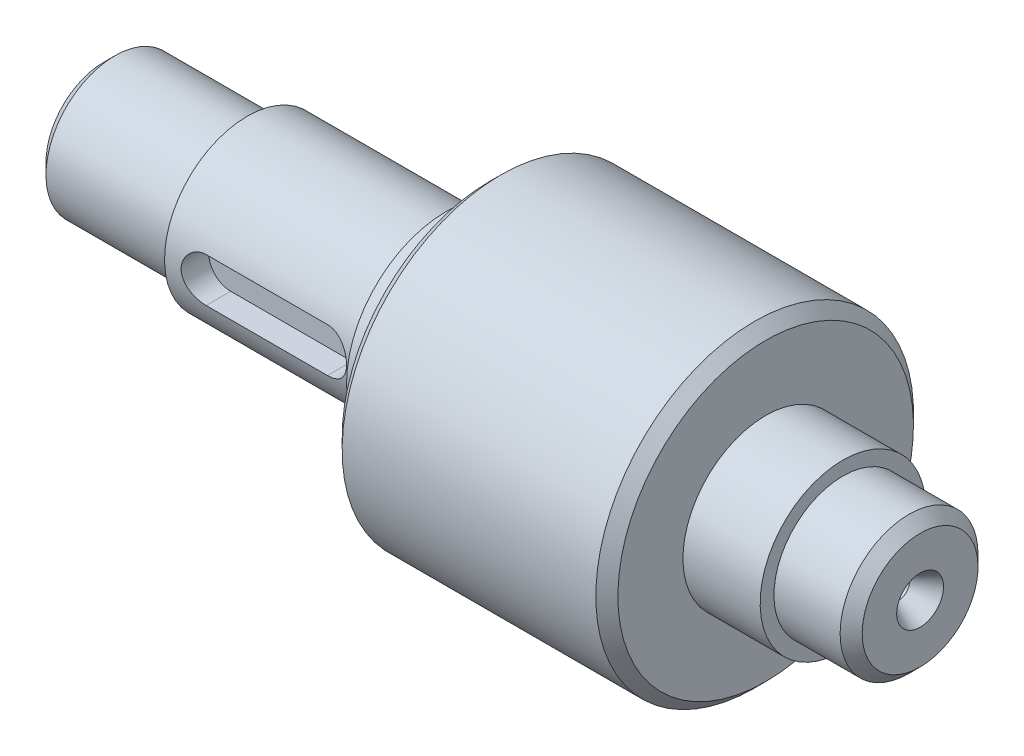
ISO-10303-21;
HEADER;
FILE_DESCRIPTION(('STEP AP214'),'2;1');
FILE_NAME('part.step','',(''),(''),'','','');
FILE_SCHEMA(('AUTOMOTIVE_DESIGN { 1 0 10303 214 1 1 1 1 }'));
ENDSEC;
DATA;
#1=APPLICATION_CONTEXT('core data for automotive mechanical design processes');
#2=APPLICATION_PROTOCOL_DEFINITION('international standard','automotive_design',2000,#1);
#3=PRODUCT_CONTEXT('',#1,'mechanical');
#4=PRODUCT('Part','Part','',(#3));
#5=PRODUCT_RELATED_PRODUCT_CATEGORY('part','',(#4));
#6=PRODUCT_DEFINITION_FORMATION('','',#4);
#7=PRODUCT_DEFINITION_CONTEXT('part definition',#1,'design');
#8=PRODUCT_DEFINITION('design','',#6,#7);
#9=PRODUCT_DEFINITION_SHAPE('','',#8);
#10=(LENGTH_UNIT() NAMED_UNIT(*) SI_UNIT(.MILLI.,.METRE.));
#11=(NAMED_UNIT(*) PLANE_ANGLE_UNIT() SI_UNIT($,.RADIAN.));
#12=(NAMED_UNIT(*) SI_UNIT($,.STERADIAN.) SOLID_ANGLE_UNIT());
#13=UNCERTAINTY_MEASURE_WITH_UNIT(LENGTH_MEASURE(1.E-05),#10,'distance_accuracy_value','');
#14=(GEOMETRIC_REPRESENTATION_CONTEXT(3) GLOBAL_UNCERTAINTY_ASSIGNED_CONTEXT((#13)) GLOBAL_UNIT_ASSIGNED_CONTEXT((#10,
#11,#12)) REPRESENTATION_CONTEXT('',''));
#15=CARTESIAN_POINT('',(0.,0.,0.));
#16=DIRECTION('',(0.,0.,1.));
#17=DIRECTION('',(1.,0.,0.));
#18=AXIS2_PLACEMENT_3D('',#15,#16,#17);
#19=CARTESIAN_POINT('',(148.,0.,0.));
#20=DIRECTION('',(1.,0.,0.));
#21=DIRECTION('',(0.,1.,0.));
#22=AXIS2_PLACEMENT_3D('',#19,#20,#21);
#23=CYLINDRICAL_SURFACE('',#22,15.);
#24=CARTESIAN_POINT('',(26.,0.,0.));
#25=DIRECTION('',(1.,0.,0.));
#26=DIRECTION('',(0.,1.,0.));
#27=AXIS2_PLACEMENT_3D('',#24,#25,#26);
#28=CIRCLE('',#27,15.);
#29=CARTESIAN_POINT('',(26.,15.,0.));
#30=VERTEX_POINT('',#29);
#31=EDGE_CURVE('E150',#30,#30,#28,.T.);
#32=ORIENTED_EDGE('',*,*,#31,.T.);
#33=EDGE_LOOP('',(#32));
#34=FACE_BOUND('',#33,.T.);
#35=CARTESIAN_POINT('',(62.,0.,0.));
#36=DIRECTION('',(1.,0.,0.));
#37=DIRECTION('',(0.,1.,0.));
#38=AXIS2_PLACEMENT_3D('',#35,#36,#37);
#39=CIRCLE('',#38,15.);
#40=CARTESIAN_POINT('',(62.,15.,0.));
#41=VERTEX_POINT('',#40);
#42=EDGE_CURVE('E147',#41,#41,#39,.T.);
#43=ORIENTED_EDGE('',*,*,#42,.F.);
#44=EDGE_LOOP('',(#43));
#45=FACE_BOUND('',#44,.T.);
#46=CARTESIAN_POINT('',(33.,4.,14.456832294801));
#47=CARTESIAN_POINT('',(32.8896417565959,4.00001309389174,14.4568189842467));
#48=CARTESIAN_POINT('',(32.7792914780071,3.99543311151603,14.4580956467717));
#49=CARTESIAN_POINT('',(32.5594213460339,3.97718874589725,14.4631301353517));
#50=CARTESIAN_POINT('',(32.4499013422403,3.96352604983924,14.4668875005959));
#51=CARTESIAN_POINT('',(32.232698346486,3.92725695741262,14.4767740441059));
#52=CARTESIAN_POINT('',(32.1250119121517,3.90466984692446,14.482898107258));
#53=CARTESIAN_POINT('',(31.9120251396444,3.85076543838184,14.4973231400467));
#54=CARTESIAN_POINT('',(31.8067248434147,3.81944798699437,14.5056241479174));
#55=CARTESIAN_POINT('',(31.4955365812247,3.71275643853686,14.5334412456827));
#56=CARTESIAN_POINT('',(31.2941250664526,3.62460332607936,14.5558829598252));
#57=CARTESIAN_POINT('',(30.9089792403742,3.4169578047582,14.6060171290377));
#58=CARTESIAN_POINT('',(30.7252507960276,3.29745504324306,14.6337113178035));
#59=CARTESIAN_POINT('',(30.3760294230722,3.0273032087801,14.6920016406366));
#60=CARTESIAN_POINT('',(30.2110381590343,2.87601544465619,14.7226489452442));
#61=CARTESIAN_POINT('',(29.9084424330384,2.54795832924029,14.7829523618628));
#62=CARTESIAN_POINT('',(29.7708424171316,2.37118484921249,14.8126083123117));
#63=CARTESIAN_POINT('',(29.5248278698146,1.99367199592156,14.8681604116921));
#64=CARTESIAN_POINT('',(29.4169160344217,1.79259414843396,14.8939887414057));
#65=CARTESIAN_POINT('',(29.2366271110388,1.37435575552791,14.9383834129136));
#66=CARTESIAN_POINT('',(29.1642423552231,1.15719869214847,14.9569513215518));
#67=CARTESIAN_POINT('',(29.0586901748307,0.718234307369676,14.9843709217852));
#68=CARTESIAN_POINT('',(29.0246627871064,0.49664729342811,14.9934353394138));
#69=CARTESIAN_POINT('',(28.994085686777,0.0507319917605802,15.0015705103633));
#70=CARTESIAN_POINT('',(28.9975305158075,-0.173595891963454,15.0006427191926));
#71=CARTESIAN_POINT('',(29.0411956863682,-0.61262950264217,14.9890534931377));
#72=CARTESIAN_POINT('',(29.0804861276563,-0.827435206418325,14.9786381919443));
#73=CARTESIAN_POINT('',(29.1932251508633,-1.24728467665105,14.9495347795913));
#74=CARTESIAN_POINT('',(29.2666753521507,-1.45232797980575,14.9308462762364));
#75=CARTESIAN_POINT('',(29.4463599662528,-1.84920963545355,14.8869312076945));
#76=CARTESIAN_POINT('',(29.5529133722298,-2.04089626466617,14.8616414267933));
#77=CARTESIAN_POINT('',(29.7955427689646,-2.40398441957148,14.8072486052897));
#78=CARTESIAN_POINT('',(29.9316239221831,-2.57538239000351,14.7781448982353));
#79=CARTESIAN_POINT('',(30.2343279711014,-2.8985493503678,14.7182294237973));
#80=CARTESIAN_POINT('',(30.4017580078943,-3.04955722400808,14.6873926412644));
#81=CARTESIAN_POINT('',(30.7600428407092,-3.32161448391783,14.6282716207252));
#82=CARTESIAN_POINT('',(30.9509040964812,-3.4426555807802,14.5999880903709));
#83=CARTESIAN_POINT('',(31.2513532833646,-3.59932937334133,14.5618587427771));
#84=CARTESIAN_POINT('',(31.354288915041,-3.64754371945348,14.5498268172621));
#85=CARTESIAN_POINT('',(31.5640463212715,-3.73509417643326,14.5275984074126));
#86=CARTESIAN_POINT('',(31.6708665124627,-3.77443385857864,14.5174011851057));
#87=CARTESIAN_POINT('',(31.8875194192202,-3.843867838105,14.4991713081511));
#88=CARTESIAN_POINT('',(31.997348878193,-3.87397173088603,14.4911364080612));
#89=CARTESIAN_POINT('',(32.219275221125,-3.92471856960774,14.4774747012192));
#90=CARTESIAN_POINT('',(32.33137102282,-3.9453659249532,14.4718467722231));
#91=CARTESIAN_POINT('',(32.536251024718,-3.97411378733403,14.4639761334309));
#92=CARTESIAN_POINT('',(32.6287964461673,-3.98382319960777,14.4613012625133));
#93=CARTESIAN_POINT('',(32.8142253533099,-3.99676420153356,14.4577275048596));
#94=CARTESIAN_POINT('',(32.9071080704325,-4.00000603663184,14.4568258092259));
#95=CARTESIAN_POINT('',(33.,-4.,14.456832294801));
#96=B_SPLINE_CURVE_WITH_KNOTS('',3,(#46,#47,#48,#49,#50,#51,#52,#53,#54,#55,#56,#57,#58,#59,#60,
#61,#62,#63,#64,#65,#66,#67,#68,#69,#70,#71,#72,#73,#74,#75,#76,#77,#78,#79,#80,#81,#82,#83,#84,
#85,#86,#87,#88,#89,#90,#91,#92,#93,#94,#95),.UNSPECIFIED.,.F.,.F.,(4,2,2,2,2,2,2,2,2,2,2,2,2,2,
2,2,2,2,2,2,2,2,2,2,4),(0.,0.330958670878051,0.661855880768517,0.992041890688581,
1.32223370010825,1.98190700187181,2.64179842357631,3.31649637536149,3.99130375261118,
4.67691814590523,5.3623844975935,6.03215661862343,6.7018311790669,7.35461236515045,
8.00742449996358,8.66673340793703,9.32615767867957,10.0057598785669,10.6855498604333,
11.0281077435251,11.3705275300852,11.7125903499581,12.0544935096114,12.3335333037377,
12.6121307120356),.UNSPECIFIED.);
#97=CARTESIAN_POINT('',(33.,4.,14.456832294801));
#98=VERTEX_POINT('',#97);
#99=CARTESIAN_POINT('',(33.,-4.,14.456832294801));
#100=VERTEX_POINT('',#99);
#101=EDGE_CURVE('E89',#98,#100,#96,.T.);
#102=ORIENTED_EDGE('',*,*,#101,.F.);
#103=DIRECTION('',(1.,0.,0.));
#104=VECTOR('',#103,1.);
#105=CARTESIAN_POINT('',(148.,4.00000000000002,14.456832294801));
#106=LINE('',#105,#104);
#107=CARTESIAN_POINT('',(55.,4.00000000000002,14.456832294801));
#108=VERTEX_POINT('',#107);
#109=EDGE_CURVE('E156',#108,#98,#106,.F.);
#110=ORIENTED_EDGE('',*,*,#109,.F.);
#111=CARTESIAN_POINT('',(55.,-4.,14.456832294801));
#112=CARTESIAN_POINT('',(55.1103582434041,-4.00001309389174,14.4568189842467));
#113=CARTESIAN_POINT('',(55.2207085219929,-3.99543311151603,14.4580956467717));
#114=CARTESIAN_POINT('',(55.4405786539661,-3.97718874589725,14.4631301353517));
#115=CARTESIAN_POINT('',(55.5500986577597,-3.96352604983923,14.4668875005959));
#116=CARTESIAN_POINT('',(55.767301653514,-3.92725695741262,14.4767740441059));
#117=CARTESIAN_POINT('',(55.8749880878483,-3.90466984692445,14.482898107258));
#118=CARTESIAN_POINT('',(56.0879748603556,-3.85076543838184,14.4973231400467));
#119=CARTESIAN_POINT('',(56.1932751565853,-3.81944798699437,14.5056241479174));
#120=CARTESIAN_POINT('',(56.5044634187753,-3.71275643853686,14.5334412456827));
#121=CARTESIAN_POINT('',(56.7058749335474,-3.62460332607935,14.5558829598252));
#122=CARTESIAN_POINT('',(57.0910207596257,-3.4169578047582,14.6060171290377));
#123=CARTESIAN_POINT('',(57.2747492039724,-3.29745504324306,14.6337113178035));
#124=CARTESIAN_POINT('',(57.6239705769278,-3.02730320878009,14.6920016406366));
#125=CARTESIAN_POINT('',(57.7889618409657,-2.87601544465618,14.7226489452442));
#126=CARTESIAN_POINT('',(58.0915575669616,-2.54795832924028,14.7829523618628));
#127=CARTESIAN_POINT('',(58.2291575828684,-2.37118484921249,14.8126083123117));
#128=CARTESIAN_POINT('',(58.4751721301854,-1.99367199592156,14.8681604116921));
#129=CARTESIAN_POINT('',(58.5830839655783,-1.79259414843396,14.8939887414057));
#130=CARTESIAN_POINT('',(58.7633728889612,-1.3743557555279,14.9383834129136));
#131=CARTESIAN_POINT('',(58.8357576447769,-1.15719869214847,14.9569513215518));
#132=CARTESIAN_POINT('',(58.9413098251693,-0.718234307369672,14.9843709217852));
#133=CARTESIAN_POINT('',(58.9753372128936,-0.496647293428106,14.9934353394138));
#134=CARTESIAN_POINT('',(59.005914313223,-0.050731991760576,15.0015705103633));
#135=CARTESIAN_POINT('',(59.0024694841925,0.173595891963458,15.0006427191926));
#136=CARTESIAN_POINT('',(58.9588043136318,0.612629502642175,14.9890534931377));
#137=CARTESIAN_POINT('',(58.9195138723437,0.82743520641833,14.9786381919443));
#138=CARTESIAN_POINT('',(58.8067748491367,1.24728467665106,14.9495347795913));
#139=CARTESIAN_POINT('',(58.7333246478493,1.45232797980576,14.9308462762364));
#140=CARTESIAN_POINT('',(58.5536400337472,1.84920963545356,14.8869312076945));
#141=CARTESIAN_POINT('',(58.4470866277702,2.04089626466617,14.8616414267933));
#142=CARTESIAN_POINT('',(58.2044572310353,2.40398441957149,14.8072486052897));
#143=CARTESIAN_POINT('',(58.0683760778169,2.57538239000351,14.7781448982353));
#144=CARTESIAN_POINT('',(57.7656720288986,2.89854935036781,14.7182294237973));
#145=CARTESIAN_POINT('',(57.5982419921057,3.04955722400809,14.6873926412644));
#146=CARTESIAN_POINT('',(57.2399571592908,3.32161448391783,14.6282716207252));
#147=CARTESIAN_POINT('',(57.0490959035188,3.44265558078021,14.5999880903709));
#148=CARTESIAN_POINT('',(56.7486467166354,3.59932937334134,14.5618587427771));
#149=CARTESIAN_POINT('',(56.645711084959,3.64754371945348,14.5498268172621));
#150=CARTESIAN_POINT('',(56.4359536787285,3.73509417643327,14.5275984074126));
#151=CARTESIAN_POINT('',(56.3291334875372,3.77443385857864,14.5174011851057));
#152=CARTESIAN_POINT('',(56.1124805807798,3.84386783810501,14.4991713081511));
#153=CARTESIAN_POINT('',(56.002651121807,3.87397173088604,14.4911364080612));
#154=CARTESIAN_POINT('',(55.780724778875,3.92471856960775,14.4774747012191));
#155=CARTESIAN_POINT('',(55.66862897718,3.9453659249532,14.4718467722231));
#156=CARTESIAN_POINT('',(55.463748975282,3.97411378733403,14.4639761334309));
#157=CARTESIAN_POINT('',(55.3712035538327,3.98382319960777,14.4613012625133));
#158=CARTESIAN_POINT('',(55.1857746466901,3.99676420153356,14.4577275048596));
#159=CARTESIAN_POINT('',(55.0928919295675,4.00000603663184,14.4568258092259));
#160=CARTESIAN_POINT('',(55.,4.,14.456832294801));
#161=B_SPLINE_CURVE_WITH_KNOTS('',3,(#111,#112,#113,#114,#115,#116,#117,#118,#119,#120,#121,
#122,#123,#124,#125,#126,#127,#128,#129,#130,#131,#132,#133,#134,#135,#136,#137,#138,#139,#140,
#141,#142,#143,#144,#145,#146,#147,#148,#149,#150,#151,#152,#153,#154,#155,#156,#157,#158,#159,
#160),.UNSPECIFIED.,.F.,.F.,(4,2,2,2,2,2,2,2,2,2,2,2,2,2,2,2,2,2,2,2,2,2,2,2,4),(0.,
0.330958670878051,0.661855880768517,0.99204189068858,1.32223370010825,1.98190700187181,
2.64179842357632,3.31649637536149,3.99130375261118,4.67691814590523,5.3623844975935,
6.03215661862343,6.7018311790669,7.35461236515045,8.00742449996358,8.66673340793703,
9.32615767867957,10.0057598785669,10.6855498604333,11.0281077435251,11.3705275300852,
11.7125903499581,12.0544935096114,12.3335333037377,12.6121307120356),.UNSPECIFIED.);
#162=CARTESIAN_POINT('',(55.,-4.,14.456832294801));
#163=VERTEX_POINT('',#162);
#164=EDGE_CURVE('E158',#163,#108,#161,.T.);
#165=ORIENTED_EDGE('',*,*,#164,.F.);
#166=DIRECTION('',(1.,0.,0.));
#167=VECTOR('',#166,1.);
#168=CARTESIAN_POINT('',(148.,-3.99999999999998,14.456832294801));
#169=LINE('',#168,#167);
#170=EDGE_CURVE('E166',#100,#163,#169,.T.);
#171=ORIENTED_EDGE('',*,*,#170,.F.);
#172=EDGE_LOOP('',(#102,#110,#165,#171));
#173=FACE_BOUND('',#172,.T.);
#174=ADVANCED_FACE('F37',(#34,#45,#173),#23,.T.);
#175=CARTESIAN_POINT('',(0.,0.,0.));
#176=DIRECTION('',(1.,0.,0.));
#177=DIRECTION('',(0.,1.,0.));
#178=AXIS2_PLACEMENT_3D('',#175,#176,#177);
#179=PLANE('',#178);
#180=CARTESIAN_POINT('',(0.,0.,0.));
#181=DIRECTION('',(1.,0.,0.));
#182=DIRECTION('',(0.,1.,0.));
#183=AXIS2_PLACEMENT_3D('',#180,#181,#182);
#184=CIRCLE('',#183,10.5000000000001);
#185=CARTESIAN_POINT('',(0.,10.5000000000001,0.));
#186=VERTEX_POINT('',#185);
#187=EDGE_CURVE('E194',#186,#186,#184,.F.);
#188=ORIENTED_EDGE('',*,*,#187,.T.);
#189=EDGE_LOOP('',(#188));
#190=FACE_BOUND('',#189,.T.);
#191=CARTESIAN_POINT('',(0.,0.,0.));
#192=DIRECTION('',(-1.,0.,0.));
#193=DIRECTION('',(0.,0.,1.));
#194=AXIS2_PLACEMENT_3D('',#191,#192,#193);
#195=CIRCLE('',#194,4.25);
#196=CARTESIAN_POINT('',(0.,0.,4.25));
#197=VERTEX_POINT('',#196);
#198=EDGE_CURVE('E123',#197,#197,#195,.T.);
#199=ORIENTED_EDGE('',*,*,#198,.F.);
#200=EDGE_LOOP('',(#199));
#201=FACE_BOUND('',#200,.T.);
#202=ADVANCED_FACE('F239',(#190,#201),#179,.F.);
#203=CARTESIAN_POINT('',(148.,0.,0.));
#204=DIRECTION('',(1.,0.,0.));
#205=DIRECTION('',(0.,1.,0.));
#206=AXIS2_PLACEMENT_3D('',#203,#204,#205);
#207=CYLINDRICAL_SURFACE('',#206,12.5);
#208=CARTESIAN_POINT('',(1.99999999999995,0.,0.));
#209=DIRECTION('',(1.,0.,0.));
#210=DIRECTION('',(0.,1.,0.));
#211=AXIS2_PLACEMENT_3D('',#208,#209,#210);
#212=CIRCLE('',#211,12.5);
#213=CARTESIAN_POINT('',(1.99999999999995,12.5,0.));
#214=VERTEX_POINT('',#213);
#215=EDGE_CURVE('E191',#214,#214,#212,.T.);
#216=ORIENTED_EDGE('',*,*,#215,.T.);
#217=EDGE_LOOP('',(#216));
#218=FACE_BOUND('',#217,.T.);
#219=CARTESIAN_POINT('',(26.,0.,0.));
#220=DIRECTION('',(1.,0.,0.));
#221=DIRECTION('',(0.,1.,0.));
#222=AXIS2_PLACEMENT_3D('',#219,#220,#221);
#223=CIRCLE('',#222,12.5);
#224=CARTESIAN_POINT('',(26.,12.5,0.));
#225=VERTEX_POINT('',#224);
#226=EDGE_CURVE('E153',#225,#225,#223,.T.);
#227=ORIENTED_EDGE('',*,*,#226,.F.);
#228=EDGE_LOOP('',(#227));
#229=FACE_BOUND('',#228,.T.);
#230=ADVANCED_FACE('F244',(#218,#229),#207,.T.);
#231=CARTESIAN_POINT('',(26.,-12.5,0.));
#232=DIRECTION('',(1.,0.,0.));
#233=DIRECTION('',(0.,1.,0.));
#234=AXIS2_PLACEMENT_3D('',#231,#232,#233);
#235=PLANE('',#234);
#236=ORIENTED_EDGE('',*,*,#31,.F.);
#237=EDGE_LOOP('',(#236));
#238=FACE_BOUND('',#237,.T.);
#239=ORIENTED_EDGE('',*,*,#226,.T.);
#240=EDGE_LOOP('',(#239));
#241=FACE_BOUND('',#240,.T.);
#242=ADVANCED_FACE('F283',(#238,#241),#235,.F.);
#243=CARTESIAN_POINT('',(62.,-15.,0.));
#244=DIRECTION('',(1.,0.,0.));
#245=DIRECTION('',(0.,1.,0.));
#246=AXIS2_PLACEMENT_3D('',#243,#244,#245);
#247=PLANE('',#246);
#248=CARTESIAN_POINT('',(62.,0.,0.));
#249=DIRECTION('',(1.,0.,0.));
#250=DIRECTION('',(0.,1.,0.));
#251=AXIS2_PLACEMENT_3D('',#248,#249,#250);
#252=CIRCLE('',#251,18.);
#253=CARTESIAN_POINT('',(62.,18.,0.));
#254=VERTEX_POINT('',#253);
#255=EDGE_CURVE('E144',#254,#254,#252,.T.);
#256=ORIENTED_EDGE('',*,*,#255,.F.);
#257=EDGE_LOOP('',(#256));
#258=FACE_BOUND('',#257,.T.);
#259=ORIENTED_EDGE('',*,*,#42,.T.);
#260=EDGE_LOOP('',(#259));
#261=FACE_BOUND('',#260,.T.);
#262=ADVANCED_FACE('F286',(#258,#261),#247,.F.);
#263=CARTESIAN_POINT('',(148.,0.,0.));
#264=DIRECTION('',(1.,0.,0.));
#265=DIRECTION('',(0.,1.,0.));
#266=AXIS2_PLACEMENT_3D('',#263,#264,#265);
#267=CYLINDRICAL_SURFACE('',#266,18.);
#268=CARTESIAN_POINT('',(70.,0.,0.));
#269=DIRECTION('',(1.,0.,0.));
#270=DIRECTION('',(0.,1.,0.));
#271=AXIS2_PLACEMENT_3D('',#268,#269,#270);
#272=CIRCLE('',#271,18.);
#273=CARTESIAN_POINT('',(70.,18.,0.));
#274=VERTEX_POINT('',#273);
#275=EDGE_CURVE('E141',#274,#274,#272,.T.);
#276=ORIENTED_EDGE('',*,*,#275,.F.);
#277=EDGE_LOOP('',(#276));
#278=FACE_BOUND('',#277,.T.);
#279=ORIENTED_EDGE('',*,*,#255,.T.);
#280=EDGE_LOOP('',(#279));
#281=FACE_BOUND('',#280,.T.);
#282=ADVANCED_FACE('F291',(#278,#281),#267,.T.);
#283=CARTESIAN_POINT('',(70.,-18.,0.));
#284=DIRECTION('',(1.,0.,0.));
#285=DIRECTION('',(0.,1.,0.));
#286=AXIS2_PLACEMENT_3D('',#283,#284,#285);
#287=PLANE('',#286);
#288=CARTESIAN_POINT('',(70.,0.,0.));
#289=DIRECTION('',(1.,0.,0.));
#290=DIRECTION('',(0.,1.,0.));
#291=AXIS2_PLACEMENT_3D('',#288,#289,#290);
#292=CIRCLE('',#291,26.8);
#293=CARTESIAN_POINT('',(70.,26.8,0.));
#294=VERTEX_POINT('',#293);
#295=EDGE_CURVE('E11',#294,#294,#292,.F.);
#296=ORIENTED_EDGE('',*,*,#295,.T.);
#297=EDGE_LOOP('',(#296));
#298=FACE_BOUND('',#297,.T.);
#299=ORIENTED_EDGE('',*,*,#275,.T.);
#300=EDGE_LOOP('',(#299));
#301=FACE_BOUND('',#300,.T.);
#302=ADVANCED_FACE('F299',(#298,#301),#287,.F.);
#303=CARTESIAN_POINT('',(148.,0.,0.));
#304=DIRECTION('',(1.,0.,0.));
#305=DIRECTION('',(0.,1.,0.));
#306=AXIS2_PLACEMENT_3D('',#303,#304,#305);
#307=CYLINDRICAL_SURFACE('',#306,28.8);
#308=CARTESIAN_POINT('',(118.,0.,0.));
#309=DIRECTION('',(-1.,0.,0.));
#310=DIRECTION('',(0.,-1.,0.));
#311=AXIS2_PLACEMENT_3D('',#308,#309,#310);
#312=CIRCLE('',#311,28.8);
#313=CARTESIAN_POINT('',(118.,-28.8,0.));
#314=VERTEX_POINT('',#313);
#315=EDGE_CURVE('E46',#314,#314,#312,.T.);
#316=ORIENTED_EDGE('',*,*,#315,.T.);
#317=EDGE_LOOP('',(#316));
#318=FACE_BOUND('',#317,.T.);
#319=CARTESIAN_POINT('',(72.,0.,0.));
#320=DIRECTION('',(1.,0.,0.));
#321=DIRECTION('',(0.,1.,0.));
#322=AXIS2_PLACEMENT_3D('',#319,#320,#321);
#323=CIRCLE('',#322,28.8);
#324=CARTESIAN_POINT('',(72.,28.8,0.));
#325=VERTEX_POINT('',#324);
#326=EDGE_CURVE('E206',#325,#325,#323,.T.);
#327=ORIENTED_EDGE('',*,*,#326,.T.);
#328=EDGE_LOOP('',(#327));
#329=FACE_BOUND('',#328,.T.);
#330=ADVANCED_FACE('F211',(#318,#329),#307,.T.);
#331=CARTESIAN_POINT('',(120.,-28.8,0.));
#332=DIRECTION('',(-1.,0.,0.));
#333=DIRECTION('',(0.,-1.,0.));
#334=AXIS2_PLACEMENT_3D('',#331,#332,#333);
#335=PLANE('',#334);
#336=CARTESIAN_POINT('',(120.,0.,0.));
#337=DIRECTION('',(-1.,0.,0.));
#338=DIRECTION('',(0.,-1.,0.));
#339=AXIS2_PLACEMENT_3D('',#336,#337,#338);
#340=CIRCLE('',#339,26.8);
#341=CARTESIAN_POINT('',(120.,-26.8,0.));
#342=VERTEX_POINT('',#341);
#343=EDGE_CURVE('E203',#342,#342,#340,.F.);
#344=ORIENTED_EDGE('',*,*,#343,.T.);
#345=EDGE_LOOP('',(#344));
#346=FACE_BOUND('',#345,.T.);
#347=CARTESIAN_POINT('',(120.,0.,0.));
#348=DIRECTION('',(1.,0.,0.));
#349=DIRECTION('',(0.,1.,0.));
#350=AXIS2_PLACEMENT_3D('',#347,#348,#349);
#351=CIRCLE('',#350,15.);
#352=CARTESIAN_POINT('',(120.,15.,0.));
#353=VERTEX_POINT('',#352);
#354=EDGE_CURVE('E138',#353,#353,#351,.T.);
#355=ORIENTED_EDGE('',*,*,#354,.F.);
#356=EDGE_LOOP('',(#355));
#357=FACE_BOUND('',#356,.T.);
#358=ADVANCED_FACE('F220',(#346,#357),#335,.F.);
#359=CARTESIAN_POINT('',(148.,0.,0.));
#360=DIRECTION('',(1.,0.,0.));
#361=DIRECTION('',(0.,1.,0.));
#362=AXIS2_PLACEMENT_3D('',#359,#360,#361);
#363=CYLINDRICAL_SURFACE('',#362,15.);
#364=CARTESIAN_POINT('',(134.,0.,0.));
#365=DIRECTION('',(1.,0.,0.));
#366=DIRECTION('',(0.,1.,0.));
#367=AXIS2_PLACEMENT_3D('',#364,#365,#366);
#368=CIRCLE('',#367,15.);
#369=CARTESIAN_POINT('',(134.,15.,0.));
#370=VERTEX_POINT('',#369);
#371=EDGE_CURVE('E135',#370,#370,#368,.T.);
#372=ORIENTED_EDGE('',*,*,#371,.F.);
#373=EDGE_LOOP('',(#372));
#374=FACE_BOUND('',#373,.T.);
#375=ORIENTED_EDGE('',*,*,#354,.T.);
#376=EDGE_LOOP('',(#375));
#377=FACE_BOUND('',#376,.T.);
#378=ADVANCED_FACE('F223',(#374,#377),#363,.T.);
#379=CARTESIAN_POINT('',(134.,-15.,0.));
#380=DIRECTION('',(-1.,0.,0.));
#381=DIRECTION('',(0.,-1.,0.));
#382=AXIS2_PLACEMENT_3D('',#379,#380,#381);
#383=PLANE('',#382);
#384=CARTESIAN_POINT('',(134.,0.,0.));
#385=DIRECTION('',(1.,0.,0.));
#386=DIRECTION('',(0.,1.,0.));
#387=AXIS2_PLACEMENT_3D('',#384,#385,#386);
#388=CIRCLE('',#387,12.5);
#389=CARTESIAN_POINT('',(134.,12.5,0.));
#390=VERTEX_POINT('',#389);
#391=EDGE_CURVE('E132',#390,#390,#388,.T.);
#392=ORIENTED_EDGE('',*,*,#391,.F.);
#393=EDGE_LOOP('',(#392));
#394=FACE_BOUND('',#393,.T.);
#395=ORIENTED_EDGE('',*,*,#371,.T.);
#396=EDGE_LOOP('',(#395));
#397=FACE_BOUND('',#396,.T.);
#398=ADVANCED_FACE('F228',(#394,#397),#383,.F.);
#399=CARTESIAN_POINT('',(148.,0.,0.));
#400=DIRECTION('',(1.,0.,0.));
#401=DIRECTION('',(0.,1.,0.));
#402=AXIS2_PLACEMENT_3D('',#399,#400,#401);
#403=CYLINDRICAL_SURFACE('',#402,12.5);
#404=CARTESIAN_POINT('',(146.,0.,0.));
#405=DIRECTION('',(-1.,0.,0.));
#406=DIRECTION('',(0.,-1.,0.));
#407=AXIS2_PLACEMENT_3D('',#404,#405,#406);
#408=CIRCLE('',#407,12.5);
#409=CARTESIAN_POINT('',(146.,-12.5,0.));
#410=VERTEX_POINT('',#409);
#411=EDGE_CURVE('E200',#410,#410,#408,.T.);
#412=ORIENTED_EDGE('',*,*,#411,.T.);
#413=EDGE_LOOP('',(#412));
#414=FACE_BOUND('',#413,.T.);
#415=ORIENTED_EDGE('',*,*,#391,.T.);
#416=EDGE_LOOP('',(#415));
#417=FACE_BOUND('',#416,.T.);
#418=ADVANCED_FACE('F234',(#414,#417),#403,.T.);
#419=CARTESIAN_POINT('',(148.,-12.5,0.));
#420=DIRECTION('',(-1.,0.,0.));
#421=DIRECTION('',(0.,-1.,0.));
#422=AXIS2_PLACEMENT_3D('',#419,#420,#421);
#423=PLANE('',#422);
#424=CARTESIAN_POINT('',(148.,0.,0.));
#425=DIRECTION('',(-1.,0.,0.));
#426=DIRECTION('',(0.,-1.,0.));
#427=AXIS2_PLACEMENT_3D('',#424,#425,#426);
#428=CIRCLE('',#427,10.5);
#429=CARTESIAN_POINT('',(148.,-10.5,0.));
#430=VERTEX_POINT('',#429);
#431=EDGE_CURVE('E197',#430,#430,#428,.F.);
#432=ORIENTED_EDGE('',*,*,#431,.T.);
#433=EDGE_LOOP('',(#432));
#434=FACE_BOUND('',#433,.T.);
#435=CARTESIAN_POINT('',(148.,0.,0.));
#436=DIRECTION('',(-1.,0.,0.));
#437=DIRECTION('',(0.,0.,1.));
#438=AXIS2_PLACEMENT_3D('',#435,#436,#437);
#439=CIRCLE('',#438,4.25);
#440=CARTESIAN_POINT('',(148.,0.,4.25));
#441=VERTEX_POINT('',#440);
#442=EDGE_CURVE('E92',#441,#441,#439,.T.);
#443=ORIENTED_EDGE('',*,*,#442,.T.);
#444=EDGE_LOOP('',(#443));
#445=FACE_BOUND('',#444,.T.);
#446=ADVANCED_FACE('F327',(#434,#445),#423,.F.);
#447=CARTESIAN_POINT('',(10.0547005383793,0.,0.));
#448=DIRECTION('',(-1.,0.,0.));
#449=DIRECTION('',(0.,0.,1.));
#450=AXIS2_PLACEMENT_3D('',#447,#448,#449);
#451=CONICAL_SURFACE('',#450,0.,1.04719755119659);
#452=CARTESIAN_POINT('',(8.9,0.,0.));
#453=DIRECTION('',(-1.,0.,0.));
#454=DIRECTION('',(0.,0.,1.));
#455=AXIS2_PLACEMENT_3D('',#452,#453,#454);
#456=CIRCLE('',#455,2.);
#457=CARTESIAN_POINT('',(8.9,0.,2.));
#458=VERTEX_POINT('',#457);
#459=EDGE_CURVE('E129',#458,#458,#456,.T.);
#460=ORIENTED_EDGE('',*,*,#459,.T.);
#461=EDGE_LOOP('',(#460));
#462=FACE_BOUND('',#461,.T.);
#463=CARTESIAN_POINT('',(10.0547005383793,0.,0.));
#464=VERTEX_POINT('',#463);
#465=VERTEX_LOOP('',#464);
#466=FACE_BOUND('',#465,.T.);
#467=ADVANCED_FACE('F338',(#462,#466),#451,.F.);
#468=CARTESIAN_POINT('',(0.,0.,0.));
#469=DIRECTION('',(-1.,0.,0.));
#470=DIRECTION('',(0.,0.,1.));
#471=AXIS2_PLACEMENT_3D('',#468,#469,#470);
#472=CYLINDRICAL_SURFACE('',#471,2.);
#473=CARTESIAN_POINT('',(3.9,0.,0.));
#474=DIRECTION('',(-1.,0.,0.));
#475=DIRECTION('',(0.,0.,1.));
#476=AXIS2_PLACEMENT_3D('',#473,#474,#475);
#477=CIRCLE('',#476,2.);
#478=CARTESIAN_POINT('',(3.9,0.,2.));
#479=VERTEX_POINT('',#478);
#480=EDGE_CURVE('E126',#479,#479,#477,.T.);
#481=ORIENTED_EDGE('',*,*,#480,.T.);
#482=EDGE_LOOP('',(#481));
#483=FACE_BOUND('',#482,.T.);
#484=ORIENTED_EDGE('',*,*,#459,.F.);
#485=EDGE_LOOP('',(#484));
#486=FACE_BOUND('',#485,.T.);
#487=ADVANCED_FACE('F435',(#483,#486),#472,.F.);
#488=CARTESIAN_POINT('',(3.9,0.,0.));
#489=DIRECTION('',(-1.,0.,0.));
#490=DIRECTION('',(0.,0.,1.));
#491=AXIS2_PLACEMENT_3D('',#488,#489,#490);
#492=CONICAL_SURFACE('',#491,2.,0.523278322131976);
#493=ORIENTED_EDGE('',*,*,#198,.T.);
#494=EDGE_LOOP('',(#493));
#495=FACE_BOUND('',#494,.T.);
#496=ORIENTED_EDGE('',*,*,#480,.F.);
#497=EDGE_LOOP('',(#496));
#498=FACE_BOUND('',#497,.T.);
#499=ADVANCED_FACE('F426',(#495,#498),#492,.F.);
#500=CARTESIAN_POINT('',(137.945299461621,0.,0.));
#501=DIRECTION('',(1.,0.,0.));
#502=DIRECTION('',(0.,0.,1.));
#503=AXIS2_PLACEMENT_3D('',#500,#501,#502);
#504=CONICAL_SURFACE('',#503,0.,1.04719755119659);
#505=CARTESIAN_POINT('',(139.1,0.,0.));
#506=DIRECTION('',(-1.,0.,0.));
#507=DIRECTION('',(0.,0.,1.));
#508=AXIS2_PLACEMENT_3D('',#505,#506,#507);
#509=CIRCLE('',#508,2.);
#510=CARTESIAN_POINT('',(139.1,0.,2.));
#511=VERTEX_POINT('',#510);
#512=EDGE_CURVE('E120',#511,#511,#509,.T.);
#513=ORIENTED_EDGE('',*,*,#512,.F.);
#514=EDGE_LOOP('',(#513));
#515=FACE_BOUND('',#514,.T.);
#516=CARTESIAN_POINT('',(137.945299461621,0.,0.));
#517=VERTEX_POINT('',#516);
#518=VERTEX_LOOP('',#517);
#519=FACE_BOUND('',#518,.T.);
#520=ADVANCED_FACE('F418',(#515,#519),#504,.F.);
#521=CARTESIAN_POINT('',(148.,0.,0.));
#522=DIRECTION('',(1.,0.,0.));
#523=DIRECTION('',(0.,0.,1.));
#524=AXIS2_PLACEMENT_3D('',#521,#522,#523);
#525=CYLINDRICAL_SURFACE('',#524,2.);
#526=CARTESIAN_POINT('',(144.1,0.,0.));
#527=DIRECTION('',(-1.,0.,0.));
#528=DIRECTION('',(0.,0.,1.));
#529=AXIS2_PLACEMENT_3D('',#526,#527,#528);
#530=CIRCLE('',#529,2.);
#531=CARTESIAN_POINT('',(144.1,0.,2.));
#532=VERTEX_POINT('',#531);
#533=EDGE_CURVE('E117',#532,#532,#530,.T.);
#534=ORIENTED_EDGE('',*,*,#533,.F.);
#535=EDGE_LOOP('',(#534));
#536=FACE_BOUND('',#535,.T.);
#537=ORIENTED_EDGE('',*,*,#512,.T.);
#538=EDGE_LOOP('',(#537));
#539=FACE_BOUND('',#538,.T.);
#540=ADVANCED_FACE('F410',(#536,#539),#525,.F.);
#541=CARTESIAN_POINT('',(144.1,0.,0.));
#542=DIRECTION('',(1.,0.,0.));
#543=DIRECTION('',(0.,0.,1.));
#544=AXIS2_PLACEMENT_3D('',#541,#542,#543);
#545=CONICAL_SURFACE('',#544,2.,0.523278322131976);
#546=ORIENTED_EDGE('',*,*,#442,.F.);
#547=EDGE_LOOP('',(#546));
#548=FACE_BOUND('',#547,.T.);
#549=ORIENTED_EDGE('',*,*,#533,.T.);
#550=EDGE_LOOP('',(#549));
#551=FACE_BOUND('',#550,.T.);
#552=ADVANCED_FACE('F184',(#548,#551),#545,.F.);
#553=CARTESIAN_POINT('',(33.,0.,28.8));
#554=DIRECTION('',(0.,0.,-1.));
#555=DIRECTION('',(-1.,0.,0.));
#556=AXIS2_PLACEMENT_3D('',#553,#554,#555);
#557=CYLINDRICAL_SURFACE('',#556,4.);
#558=ORIENTED_EDGE('',*,*,#101,.T.);
#559=DIRECTION('',(0.,0.,-1.));
#560=VECTOR('',#559,1.);
#561=CARTESIAN_POINT('',(33.,-4.,28.8));
#562=LINE('',#561,#560);
#563=CARTESIAN_POINT('',(33.,-4.,10.));
#564=VERTEX_POINT('',#563);
#565=EDGE_CURVE('E82',#100,#564,#562,.T.);
#566=ORIENTED_EDGE('',*,*,#565,.T.);
#567=CARTESIAN_POINT('',(33.,0.,10.));
#568=DIRECTION('',(0.,0.,1.));
#569=DIRECTION('',(1.,0.,0.));
#570=AXIS2_PLACEMENT_3D('',#567,#568,#569);
#571=CIRCLE('',#570,4.);
#572=CARTESIAN_POINT('',(33.,4.,10.));
#573=VERTEX_POINT('',#572);
#574=EDGE_CURVE('E87',#573,#564,#571,.T.);
#575=ORIENTED_EDGE('',*,*,#574,.F.);
#576=DIRECTION('',(0.,0.,-1.));
#577=VECTOR('',#576,1.);
#578=CARTESIAN_POINT('',(33.,4.,28.8));
#579=LINE('',#578,#577);
#580=EDGE_CURVE('E111',#98,#573,#579,.T.);
#581=ORIENTED_EDGE('',*,*,#580,.F.);
#582=EDGE_LOOP('',(#558,#566,#575,#581));
#583=FACE_BOUND('',#582,.T.);
#584=ADVANCED_FACE('F84',(#583),#557,.F.);
#585=CARTESIAN_POINT('',(33.,-4.,28.8));
#586=DIRECTION('',(0.,1.,0.));
#587=DIRECTION('',(-1.,0.,0.));
#588=AXIS2_PLACEMENT_3D('',#585,#586,#587);
#589=PLANE('',#588);
#590=ORIENTED_EDGE('',*,*,#170,.T.);
#591=DIRECTION('',(0.,0.,-1.));
#592=VECTOR('',#591,1.);
#593=CARTESIAN_POINT('',(55.,-4.,28.8));
#594=LINE('',#593,#592);
#595=CARTESIAN_POINT('',(55.,-4.,10.));
#596=VERTEX_POINT('',#595);
#597=EDGE_CURVE('E93',#163,#596,#594,.T.);
#598=ORIENTED_EDGE('',*,*,#597,.T.);
#599=DIRECTION('',(1.,0.,0.));
#600=VECTOR('',#599,1.);
#601=CARTESIAN_POINT('',(33.,-4.,10.));
#602=LINE('',#601,#600);
#603=EDGE_CURVE('E96',#564,#596,#602,.T.);
#604=ORIENTED_EDGE('',*,*,#603,.F.);
#605=ORIENTED_EDGE('',*,*,#565,.F.);
#606=EDGE_LOOP('',(#590,#598,#604,#605));
#607=FACE_BOUND('',#606,.T.);
#608=ADVANCED_FACE('F97',(#607),#589,.T.);
#609=CARTESIAN_POINT('',(55.,0.,28.8));
#610=DIRECTION('',(0.,0.,-1.));
#611=DIRECTION('',(-1.,0.,0.));
#612=AXIS2_PLACEMENT_3D('',#609,#610,#611);
#613=CYLINDRICAL_SURFACE('',#612,4.);
#614=ORIENTED_EDGE('',*,*,#164,.T.);
#615=DIRECTION('',(0.,0.,-1.));
#616=VECTOR('',#615,1.);
#617=CARTESIAN_POINT('',(55.,4.,28.8));
#618=LINE('',#617,#616);
#619=CARTESIAN_POINT('',(55.,4.,10.));
#620=VERTEX_POINT('',#619);
#621=EDGE_CURVE('E53',#108,#620,#618,.T.);
#622=ORIENTED_EDGE('',*,*,#621,.T.);
#623=CARTESIAN_POINT('',(55.,0.,10.));
#624=DIRECTION('',(0.,0.,1.));
#625=DIRECTION('',(1.,0.,0.));
#626=AXIS2_PLACEMENT_3D('',#623,#624,#625);
#627=CIRCLE('',#626,4.);
#628=EDGE_CURVE('E102',#596,#620,#627,.T.);
#629=ORIENTED_EDGE('',*,*,#628,.F.);
#630=ORIENTED_EDGE('',*,*,#597,.F.);
#631=EDGE_LOOP('',(#614,#622,#629,#630));
#632=FACE_BOUND('',#631,.T.);
#633=ADVANCED_FACE('F171',(#632),#613,.F.);
#634=CARTESIAN_POINT('',(33.,4.,28.8));
#635=DIRECTION('',(0.,-1.,0.));
#636=DIRECTION('',(1.,0.,0.));
#637=AXIS2_PLACEMENT_3D('',#634,#635,#636);
#638=PLANE('',#637);
#639=ORIENTED_EDGE('',*,*,#109,.T.);
#640=ORIENTED_EDGE('',*,*,#580,.T.);
#641=DIRECTION('',(-1.,0.,0.));
#642=VECTOR('',#641,1.);
#643=CARTESIAN_POINT('',(33.,4.,10.));
#644=LINE('',#643,#642);
#645=EDGE_CURVE('E106',#620,#573,#644,.T.);
#646=ORIENTED_EDGE('',*,*,#645,.F.);
#647=ORIENTED_EDGE('',*,*,#621,.F.);
#648=EDGE_LOOP('',(#639,#640,#646,#647));
#649=FACE_BOUND('',#648,.T.);
#650=ADVANCED_FACE('F176',(#649),#638,.T.);
#651=CARTESIAN_POINT('',(33.,0.,10.));
#652=DIRECTION('',(0.,0.,1.));
#653=DIRECTION('',(1.,0.,0.));
#654=AXIS2_PLACEMENT_3D('',#651,#652,#653);
#655=PLANE('',#654);
#656=ORIENTED_EDGE('',*,*,#574,.T.);
#657=ORIENTED_EDGE('',*,*,#603,.T.);
#658=ORIENTED_EDGE('',*,*,#628,.T.);
#659=ORIENTED_EDGE('',*,*,#645,.T.);
#660=EDGE_LOOP('',(#656,#657,#658,#659));
#661=FACE_BOUND('',#660,.T.);
#662=ADVANCED_FACE('F105',(#661),#655,.T.);
#663=CARTESIAN_POINT('',(1.99999999999995,0.,0.));
#664=DIRECTION('',(1.,0.,0.));
#665=DIRECTION('',(0.,1.,0.));
#666=AXIS2_PLACEMENT_3D('',#663,#664,#665);
#667=CONICAL_SURFACE('',#666,12.5,0.78539816339745);
#668=ORIENTED_EDGE('',*,*,#187,.F.);
#669=EDGE_LOOP('',(#668));
#670=FACE_BOUND('',#669,.T.);
#671=ORIENTED_EDGE('',*,*,#215,.F.);
#672=EDGE_LOOP('',(#671));
#673=FACE_BOUND('',#672,.T.);
#674=ADVANCED_FACE('F257',(#670,#673),#667,.T.);
#675=CARTESIAN_POINT('',(148.,0.,0.));
#676=DIRECTION('',(-1.,0.,0.));
#677=DIRECTION('',(0.,-1.,0.));
#678=AXIS2_PLACEMENT_3D('',#675,#676,#677);
#679=CONICAL_SURFACE('',#678,10.5,0.785398163397446);
#680=ORIENTED_EDGE('',*,*,#411,.F.);
#681=EDGE_LOOP('',(#680));
#682=FACE_BOUND('',#681,.T.);
#683=ORIENTED_EDGE('',*,*,#431,.F.);
#684=EDGE_LOOP('',(#683));
#685=FACE_BOUND('',#684,.T.);
#686=ADVANCED_FACE('F217',(#682,#685),#679,.T.);
#687=CARTESIAN_POINT('',(120.,0.,0.));
#688=DIRECTION('',(-1.,0.,0.));
#689=DIRECTION('',(0.,-1.,0.));
#690=AXIS2_PLACEMENT_3D('',#687,#688,#689);
#691=CONICAL_SURFACE('',#690,26.8,0.785398163397456);
#692=ORIENTED_EDGE('',*,*,#315,.F.);
#693=EDGE_LOOP('',(#692));
#694=FACE_BOUND('',#693,.T.);
#695=ORIENTED_EDGE('',*,*,#343,.F.);
#696=EDGE_LOOP('',(#695));
#697=FACE_BOUND('',#696,.T.);
#698=ADVANCED_FACE('F214',(#694,#697),#691,.T.);
#699=CARTESIAN_POINT('',(72.,0.,0.));
#700=DIRECTION('',(1.,0.,0.));
#701=DIRECTION('',(0.,1.,0.));
#702=AXIS2_PLACEMENT_3D('',#699,#700,#701);
#703=CONICAL_SURFACE('',#702,28.8,0.785398163397453);
#704=ORIENTED_EDGE('',*,*,#295,.F.);
#705=EDGE_LOOP('',(#704));
#706=FACE_BOUND('',#705,.T.);
#707=ORIENTED_EDGE('',*,*,#326,.F.);
#708=EDGE_LOOP('',(#707));
#709=FACE_BOUND('',#708,.T.);
#710=ADVANCED_FACE('F40',(#706,#709),#703,.T.);
#711=CLOSED_SHELL('',(#174,#202,#230,#242,#262,#282,#302,#330,#358,#378,#398,#418,#446,#467,
#487,#499,#520,#540,#552,#584,#608,#633,#650,#662,#674,#686,#698,#710));
#712=MANIFOLD_SOLID_BREP('B2',#711);
#713=ADVANCED_BREP_SHAPE_REPRESENTATION('',(#18,#712),#14);
#714=SHAPE_DEFINITION_REPRESENTATION(#9,#713);
ENDSEC;
END-ISO-10303-21;
